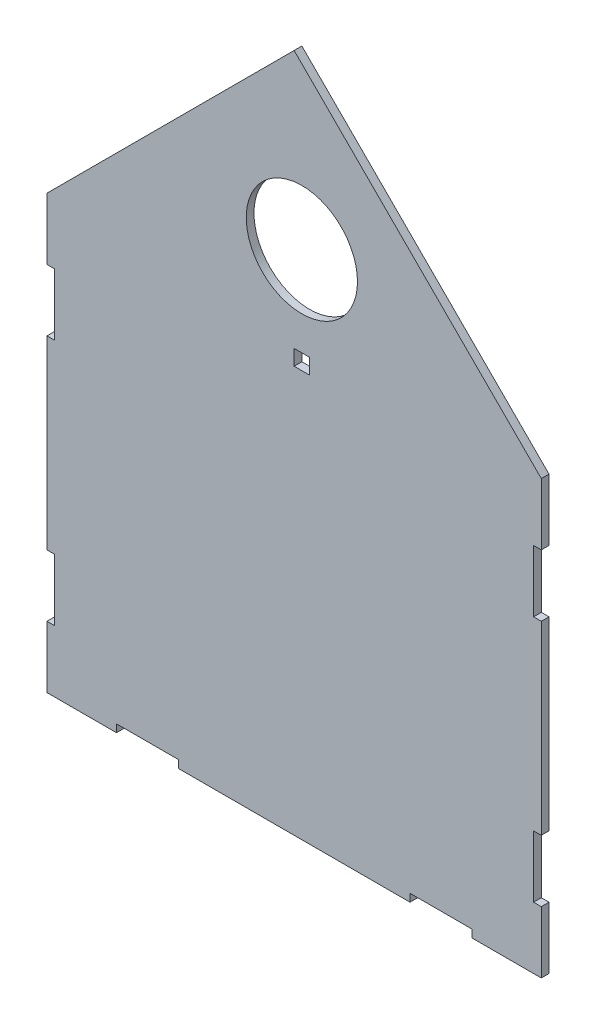
ISO-10303-21;
HEADER;
FILE_DESCRIPTION(('STEP AP214'),'2;1');
FILE_NAME('part.step','',(''),(''),'','','');
FILE_SCHEMA(('AUTOMOTIVE_DESIGN { 1 0 10303 214 1 1 1 1 }'));
ENDSEC;
DATA;
#1=APPLICATION_CONTEXT('core data for automotive mechanical design processes');
#2=APPLICATION_PROTOCOL_DEFINITION('international standard','automotive_design',2000,#1);
#3=PRODUCT_CONTEXT('',#1,'mechanical');
#4=PRODUCT('Part','Part','',(#3));
#5=PRODUCT_RELATED_PRODUCT_CATEGORY('part','',(#4));
#6=PRODUCT_DEFINITION_FORMATION('','',#4);
#7=PRODUCT_DEFINITION_CONTEXT('part definition',#1,'design');
#8=PRODUCT_DEFINITION('design','',#6,#7);
#9=PRODUCT_DEFINITION_SHAPE('','',#8);
#10=(LENGTH_UNIT() NAMED_UNIT(*) SI_UNIT(.MILLI.,.METRE.));
#11=(NAMED_UNIT(*) PLANE_ANGLE_UNIT() SI_UNIT($,.RADIAN.));
#12=(NAMED_UNIT(*) SI_UNIT($,.STERADIAN.) SOLID_ANGLE_UNIT());
#13=UNCERTAINTY_MEASURE_WITH_UNIT(LENGTH_MEASURE(1.E-05),#10,'distance_accuracy_value','');
#14=(GEOMETRIC_REPRESENTATION_CONTEXT(3) GLOBAL_UNCERTAINTY_ASSIGNED_CONTEXT((#13)) GLOBAL_UNIT_ASSIGNED_CONTEXT((#10,
#11,#12)) REPRESENTATION_CONTEXT('',''));
#15=CARTESIAN_POINT('',(0.,0.,0.));
#16=DIRECTION('',(0.,0.,1.));
#17=DIRECTION('',(1.,0.,0.));
#18=AXIS2_PLACEMENT_3D('',#15,#16,#17);
#19=CARTESIAN_POINT('',(102.164315933227,177.8,3.175));
#20=DIRECTION('',(-0.707106781186547,-0.707106781186548,0.));
#21=DIRECTION('',(0.707106781186548,-0.707106781186547,0.));
#22=AXIS2_PLACEMENT_3D('',#19,#20,#21);
#23=PLANE('',#22);
#24=DIRECTION('',(-0.707106781186548,0.707106781186547,0.));
#25=VECTOR('',#24,1.);
#26=CARTESIAN_POINT('',(102.164315933227,177.8,0.));
#27=LINE('',#26,#25);
#28=CARTESIAN_POINT('',(102.164315933227,177.8,0.));
#29=VERTEX_POINT('',#28);
#30=CARTESIAN_POINT('',(0.564315933226589,279.4,0.));
#31=VERTEX_POINT('',#30);
#32=EDGE_CURVE('E289',#29,#31,#27,.T.);
#33=ORIENTED_EDGE('',*,*,#32,.T.);
#34=DIRECTION('',(0.,0.,-1.));
#35=VECTOR('',#34,1.);
#36=CARTESIAN_POINT('',(0.564315933226589,279.4,3.175));
#37=LINE('',#36,#35);
#38=CARTESIAN_POINT('',(0.564315933226589,279.4,3.175));
#39=VERTEX_POINT('',#38);
#40=EDGE_CURVE('E11',#39,#31,#37,.T.);
#41=ORIENTED_EDGE('',*,*,#40,.F.);
#42=DIRECTION('',(-0.707106781186548,0.707106781186547,0.));
#43=VECTOR('',#42,1.);
#44=CARTESIAN_POINT('',(102.164315933227,177.8,3.175));
#45=LINE('',#44,#43);
#46=CARTESIAN_POINT('',(102.164315933227,177.8,3.175));
#47=VERTEX_POINT('',#46);
#48=EDGE_CURVE('E292',#47,#39,#45,.T.);
#49=ORIENTED_EDGE('',*,*,#48,.F.);
#50=DIRECTION('',(0.,0.,-1.));
#51=VECTOR('',#50,1.);
#52=CARTESIAN_POINT('',(102.164315933227,177.8,3.175));
#53=LINE('',#52,#51);
#54=EDGE_CURVE('E352',#47,#29,#53,.T.);
#55=ORIENTED_EDGE('',*,*,#54,.T.);
#56=EDGE_LOOP('',(#33,#41,#49,#55));
#57=FACE_BOUND('',#56,.T.);
#58=ADVANCED_FACE('F35',(#57),#23,.F.);
#59=CARTESIAN_POINT('',(0.564315933226589,279.4,3.175));
#60=DIRECTION('',(0.707106781186547,-0.707106781186548,0.));
#61=DIRECTION('',(0.707106781186548,0.707106781186547,0.));
#62=AXIS2_PLACEMENT_3D('',#59,#60,#61);
#63=PLANE('',#62);
#64=DIRECTION('',(-0.707106781186548,-0.707106781186547,0.));
#65=VECTOR('',#64,1.);
#66=CARTESIAN_POINT('',(0.564315933226589,279.4,0.));
#67=LINE('',#66,#65);
#68=CARTESIAN_POINT('',(-101.035684066773,177.8,0.));
#69=VERTEX_POINT('',#68);
#70=EDGE_CURVE('E355',#31,#69,#67,.T.);
#71=ORIENTED_EDGE('',*,*,#70,.T.);
#72=DIRECTION('',(0.,0.,-1.));
#73=VECTOR('',#72,1.);
#74=CARTESIAN_POINT('',(-101.035684066773,177.8,3.175));
#75=LINE('',#74,#73);
#76=CARTESIAN_POINT('',(-101.035684066773,177.8,3.175));
#77=VERTEX_POINT('',#76);
#78=EDGE_CURVE('E42',#77,#69,#75,.T.);
#79=ORIENTED_EDGE('',*,*,#78,.F.);
#80=DIRECTION('',(-0.707106781186548,-0.707106781186547,0.));
#81=VECTOR('',#80,1.);
#82=CARTESIAN_POINT('',(0.564315933226589,279.4,3.175));
#83=LINE('',#82,#81);
#84=EDGE_CURVE('E295',#39,#77,#83,.T.);
#85=ORIENTED_EDGE('',*,*,#84,.F.);
#86=ORIENTED_EDGE('',*,*,#40,.T.);
#87=EDGE_LOOP('',(#71,#79,#85,#86));
#88=FACE_BOUND('',#87,.T.);
#89=ADVANCED_FACE('F516',(#88),#63,.F.);
#90=CARTESIAN_POINT('',(-101.035684066773,177.8,3.175));
#91=DIRECTION('',(1.,0.,0.));
#92=DIRECTION('',(0.,0.,-1.));
#93=AXIS2_PLACEMENT_3D('',#90,#91,#92);
#94=PLANE('',#93);
#95=DIRECTION('',(0.,-1.,0.));
#96=VECTOR('',#95,1.);
#97=CARTESIAN_POINT('',(-101.035684066773,177.8,0.));
#98=LINE('',#97,#96);
#99=CARTESIAN_POINT('',(-101.035684066773,152.4,0.));
#100=VERTEX_POINT('',#99);
#101=EDGE_CURVE('E357',#69,#100,#98,.T.);
#102=ORIENTED_EDGE('',*,*,#101,.T.);
#103=DIRECTION('',(0.,0.,-1.));
#104=VECTOR('',#103,1.);
#105=CARTESIAN_POINT('',(-101.035684066773,152.4,3.175));
#106=LINE('',#105,#104);
#107=CARTESIAN_POINT('',(-101.035684066773,152.4,3.175));
#108=VERTEX_POINT('',#107);
#109=EDGE_CURVE('E487',#108,#100,#106,.T.);
#110=ORIENTED_EDGE('',*,*,#109,.F.);
#111=DIRECTION('',(0.,-1.,0.));
#112=VECTOR('',#111,1.);
#113=CARTESIAN_POINT('',(-101.035684066773,177.8,3.175));
#114=LINE('',#113,#112);
#115=EDGE_CURVE('E298',#77,#108,#114,.T.);
#116=ORIENTED_EDGE('',*,*,#115,.F.);
#117=ORIENTED_EDGE('',*,*,#78,.T.);
#118=EDGE_LOOP('',(#102,#110,#116,#117));
#119=FACE_BOUND('',#118,.T.);
#120=ADVANCED_FACE('F494',(#119),#94,.F.);
#121=CARTESIAN_POINT('',(-101.035684066773,152.4,3.175));
#122=DIRECTION('',(0.,1.,0.));
#123=DIRECTION('',(0.,0.,1.));
#124=AXIS2_PLACEMENT_3D('',#121,#122,#123);
#125=PLANE('',#124);
#126=DIRECTION('',(1.,0.,0.));
#127=VECTOR('',#126,1.);
#128=CARTESIAN_POINT('',(-101.035684066773,152.4,0.));
#129=LINE('',#128,#127);
#130=CARTESIAN_POINT('',(-97.8606840667734,152.4,0.));
#131=VERTEX_POINT('',#130);
#132=EDGE_CURVE('E359',#100,#131,#129,.T.);
#133=ORIENTED_EDGE('',*,*,#132,.T.);
#134=DIRECTION('',(0.,0.,-1.));
#135=VECTOR('',#134,1.);
#136=CARTESIAN_POINT('',(-97.8606840667734,152.4,3.175));
#137=LINE('',#136,#135);
#138=CARTESIAN_POINT('',(-97.8606840667734,152.4,3.175));
#139=VERTEX_POINT('',#138);
#140=EDGE_CURVE('E484',#139,#131,#137,.T.);
#141=ORIENTED_EDGE('',*,*,#140,.F.);
#142=DIRECTION('',(1.,0.,0.));
#143=VECTOR('',#142,1.);
#144=CARTESIAN_POINT('',(-101.035684066773,152.4,3.175));
#145=LINE('',#144,#143);
#146=EDGE_CURVE('E300',#108,#139,#145,.T.);
#147=ORIENTED_EDGE('',*,*,#146,.F.);
#148=ORIENTED_EDGE('',*,*,#109,.T.);
#149=EDGE_LOOP('',(#133,#141,#147,#148));
#150=FACE_BOUND('',#149,.T.);
#151=ADVANCED_FACE('F504',(#150),#125,.F.);
#152=CARTESIAN_POINT('',(-97.8606840667734,152.4,3.175));
#153=DIRECTION('',(1.,0.,0.));
#154=DIRECTION('',(0.,0.,-1.));
#155=AXIS2_PLACEMENT_3D('',#152,#153,#154);
#156=PLANE('',#155);
#157=DIRECTION('',(0.,-1.,0.));
#158=VECTOR('',#157,1.);
#159=CARTESIAN_POINT('',(-97.8606840667734,152.4,0.));
#160=LINE('',#159,#158);
#161=CARTESIAN_POINT('',(-97.8606840667734,127.,0.));
#162=VERTEX_POINT('',#161);
#163=EDGE_CURVE('E361',#131,#162,#160,.T.);
#164=ORIENTED_EDGE('',*,*,#163,.T.);
#165=DIRECTION('',(0.,0.,-1.));
#166=VECTOR('',#165,1.);
#167=CARTESIAN_POINT('',(-97.8606840667734,127.,3.175));
#168=LINE('',#167,#166);
#169=CARTESIAN_POINT('',(-97.8606840667734,127.,3.175));
#170=VERTEX_POINT('',#169);
#171=EDGE_CURVE('E481',#170,#162,#168,.T.);
#172=ORIENTED_EDGE('',*,*,#171,.F.);
#173=DIRECTION('',(0.,-1.,0.));
#174=VECTOR('',#173,1.);
#175=CARTESIAN_POINT('',(-97.8606840667734,152.4,3.175));
#176=LINE('',#175,#174);
#177=EDGE_CURVE('E302',#139,#170,#176,.T.);
#178=ORIENTED_EDGE('',*,*,#177,.F.);
#179=ORIENTED_EDGE('',*,*,#140,.T.);
#180=EDGE_LOOP('',(#164,#172,#178,#179));
#181=FACE_BOUND('',#180,.T.);
#182=ADVANCED_FACE('F508',(#181),#156,.F.);
#183=CARTESIAN_POINT('',(-97.8606840667734,127.,3.175));
#184=DIRECTION('',(0.,-1.,0.));
#185=DIRECTION('',(0.,0.,-1.));
#186=AXIS2_PLACEMENT_3D('',#183,#184,#185);
#187=PLANE('',#186);
#188=DIRECTION('',(-1.,0.,0.));
#189=VECTOR('',#188,1.);
#190=CARTESIAN_POINT('',(-97.8606840667734,127.,0.));
#191=LINE('',#190,#189);
#192=CARTESIAN_POINT('',(-101.035684066773,127.,0.));
#193=VERTEX_POINT('',#192);
#194=EDGE_CURVE('E363',#162,#193,#191,.T.);
#195=ORIENTED_EDGE('',*,*,#194,.T.);
#196=DIRECTION('',(0.,0.,-1.));
#197=VECTOR('',#196,1.);
#198=CARTESIAN_POINT('',(-101.035684066773,127.,3.175));
#199=LINE('',#198,#197);
#200=CARTESIAN_POINT('',(-101.035684066773,127.,3.175));
#201=VERTEX_POINT('',#200);
#202=EDGE_CURVE('E478',#201,#193,#199,.T.);
#203=ORIENTED_EDGE('',*,*,#202,.F.);
#204=DIRECTION('',(-1.,0.,0.));
#205=VECTOR('',#204,1.);
#206=CARTESIAN_POINT('',(-97.8606840667734,127.,3.175));
#207=LINE('',#206,#205);
#208=EDGE_CURVE('E304',#170,#201,#207,.T.);
#209=ORIENTED_EDGE('',*,*,#208,.F.);
#210=ORIENTED_EDGE('',*,*,#171,.T.);
#211=EDGE_LOOP('',(#195,#203,#209,#210));
#212=FACE_BOUND('',#211,.T.);
#213=ADVANCED_FACE('F634',(#212),#187,.F.);
#214=CARTESIAN_POINT('',(-101.035684066773,127.,3.175));
#215=DIRECTION('',(1.,0.,0.));
#216=DIRECTION('',(0.,1.,0.));
#217=AXIS2_PLACEMENT_3D('',#214,#215,#216);
#218=PLANE('',#217);
#219=DIRECTION('',(0.,-1.,0.));
#220=VECTOR('',#219,1.);
#221=CARTESIAN_POINT('',(-101.035684066773,127.,0.));
#222=LINE('',#221,#220);
#223=CARTESIAN_POINT('',(-101.035684066773,50.8,0.));
#224=VERTEX_POINT('',#223);
#225=EDGE_CURVE('E365',#193,#224,#222,.T.);
#226=ORIENTED_EDGE('',*,*,#225,.T.);
#227=DIRECTION('',(0.,0.,-1.));
#228=VECTOR('',#227,1.);
#229=CARTESIAN_POINT('',(-101.035684066773,50.8,3.175));
#230=LINE('',#229,#228);
#231=CARTESIAN_POINT('',(-101.035684066773,50.8,3.175));
#232=VERTEX_POINT('',#231);
#233=EDGE_CURVE('E475',#232,#224,#230,.T.);
#234=ORIENTED_EDGE('',*,*,#233,.F.);
#235=DIRECTION('',(0.,-1.,0.));
#236=VECTOR('',#235,1.);
#237=CARTESIAN_POINT('',(-101.035684066773,127.,3.175));
#238=LINE('',#237,#236);
#239=EDGE_CURVE('E306',#201,#232,#238,.T.);
#240=ORIENTED_EDGE('',*,*,#239,.F.);
#241=ORIENTED_EDGE('',*,*,#202,.T.);
#242=EDGE_LOOP('',(#226,#234,#240,#241));
#243=FACE_BOUND('',#242,.T.);
#244=ADVANCED_FACE('F632',(#243),#218,.F.);
#245=CARTESIAN_POINT('',(-101.035684066773,50.8,3.175));
#246=DIRECTION('',(0.,1.,0.));
#247=DIRECTION('',(0.,0.,1.));
#248=AXIS2_PLACEMENT_3D('',#245,#246,#247);
#249=PLANE('',#248);
#250=DIRECTION('',(1.,0.,0.));
#251=VECTOR('',#250,1.);
#252=CARTESIAN_POINT('',(-101.035684066773,50.8,0.));
#253=LINE('',#252,#251);
#254=CARTESIAN_POINT('',(-97.8606840667734,50.8,0.));
#255=VERTEX_POINT('',#254);
#256=EDGE_CURVE('E367',#224,#255,#253,.T.);
#257=ORIENTED_EDGE('',*,*,#256,.T.);
#258=DIRECTION('',(0.,0.,-1.));
#259=VECTOR('',#258,1.);
#260=CARTESIAN_POINT('',(-97.8606840667734,50.8,3.175));
#261=LINE('',#260,#259);
#262=CARTESIAN_POINT('',(-97.8606840667734,50.8,3.175));
#263=VERTEX_POINT('',#262);
#264=EDGE_CURVE('E472',#263,#255,#261,.T.);
#265=ORIENTED_EDGE('',*,*,#264,.F.);
#266=DIRECTION('',(1.,0.,0.));
#267=VECTOR('',#266,1.);
#268=CARTESIAN_POINT('',(-101.035684066773,50.8,3.175));
#269=LINE('',#268,#267);
#270=EDGE_CURVE('E308',#232,#263,#269,.T.);
#271=ORIENTED_EDGE('',*,*,#270,.F.);
#272=ORIENTED_EDGE('',*,*,#233,.T.);
#273=EDGE_LOOP('',(#257,#265,#271,#272));
#274=FACE_BOUND('',#273,.T.);
#275=ADVANCED_FACE('F627',(#274),#249,.F.);
#276=CARTESIAN_POINT('',(-97.8606840667734,50.8,3.175));
#277=DIRECTION('',(1.,0.,0.));
#278=DIRECTION('',(0.,0.,-1.));
#279=AXIS2_PLACEMENT_3D('',#276,#277,#278);
#280=PLANE('',#279);
#281=DIRECTION('',(0.,-1.,0.));
#282=VECTOR('',#281,1.);
#283=CARTESIAN_POINT('',(-97.8606840667734,50.8,0.));
#284=LINE('',#283,#282);
#285=CARTESIAN_POINT('',(-97.8606840667734,25.4,0.));
#286=VERTEX_POINT('',#285);
#287=EDGE_CURVE('E369',#255,#286,#284,.T.);
#288=ORIENTED_EDGE('',*,*,#287,.T.);
#289=DIRECTION('',(0.,0.,-1.));
#290=VECTOR('',#289,1.);
#291=CARTESIAN_POINT('',(-97.8606840667734,25.4,3.175));
#292=LINE('',#291,#290);
#293=CARTESIAN_POINT('',(-97.8606840667734,25.4,3.175));
#294=VERTEX_POINT('',#293);
#295=EDGE_CURVE('E469',#294,#286,#292,.T.);
#296=ORIENTED_EDGE('',*,*,#295,.F.);
#297=DIRECTION('',(0.,-1.,0.));
#298=VECTOR('',#297,1.);
#299=CARTESIAN_POINT('',(-97.8606840667734,50.8,3.175));
#300=LINE('',#299,#298);
#301=EDGE_CURVE('E310',#263,#294,#300,.T.);
#302=ORIENTED_EDGE('',*,*,#301,.F.);
#303=ORIENTED_EDGE('',*,*,#264,.T.);
#304=EDGE_LOOP('',(#288,#296,#302,#303));
#305=FACE_BOUND('',#304,.T.);
#306=ADVANCED_FACE('F622',(#305),#280,.F.);
#307=CARTESIAN_POINT('',(-97.8606840667734,25.4,3.175));
#308=DIRECTION('',(0.,-1.,0.));
#309=DIRECTION('',(0.,0.,-1.));
#310=AXIS2_PLACEMENT_3D('',#307,#308,#309);
#311=PLANE('',#310);
#312=DIRECTION('',(-1.,0.,0.));
#313=VECTOR('',#312,1.);
#314=CARTESIAN_POINT('',(-97.8606840667734,25.4,0.));
#315=LINE('',#314,#313);
#316=CARTESIAN_POINT('',(-101.035684066773,25.4,0.));
#317=VERTEX_POINT('',#316);
#318=EDGE_CURVE('E371',#286,#317,#315,.T.);
#319=ORIENTED_EDGE('',*,*,#318,.T.);
#320=DIRECTION('',(0.,0.,-1.));
#321=VECTOR('',#320,1.);
#322=CARTESIAN_POINT('',(-101.035684066773,25.4,3.175));
#323=LINE('',#322,#321);
#324=CARTESIAN_POINT('',(-101.035684066773,25.4,3.175));
#325=VERTEX_POINT('',#324);
#326=EDGE_CURVE('E466',#325,#317,#323,.T.);
#327=ORIENTED_EDGE('',*,*,#326,.F.);
#328=DIRECTION('',(-1.,0.,0.));
#329=VECTOR('',#328,1.);
#330=CARTESIAN_POINT('',(-97.8606840667734,25.4,3.175));
#331=LINE('',#330,#329);
#332=EDGE_CURVE('E312',#294,#325,#331,.T.);
#333=ORIENTED_EDGE('',*,*,#332,.F.);
#334=ORIENTED_EDGE('',*,*,#295,.T.);
#335=EDGE_LOOP('',(#319,#327,#333,#334));
#336=FACE_BOUND('',#335,.T.);
#337=ADVANCED_FACE('F618',(#336),#311,.F.);
#338=CARTESIAN_POINT('',(-101.035684066773,25.4,3.175));
#339=DIRECTION('',(1.,0.,0.));
#340=DIRECTION('',(0.,0.,-1.));
#341=AXIS2_PLACEMENT_3D('',#338,#339,#340);
#342=PLANE('',#341);
#343=DIRECTION('',(0.,-1.,0.));
#344=VECTOR('',#343,1.);
#345=CARTESIAN_POINT('',(-101.035684066773,25.4,0.));
#346=LINE('',#345,#344);
#347=CARTESIAN_POINT('',(-101.035684066773,0.,0.));
#348=VERTEX_POINT('',#347);
#349=EDGE_CURVE('E373',#317,#348,#346,.T.);
#350=ORIENTED_EDGE('',*,*,#349,.T.);
#351=DIRECTION('',(0.,0.,-1.));
#352=VECTOR('',#351,1.);
#353=CARTESIAN_POINT('',(-101.035684066773,0.,3.175));
#354=LINE('',#353,#352);
#355=CARTESIAN_POINT('',(-101.035684066773,0.,3.175));
#356=VERTEX_POINT('',#355);
#357=EDGE_CURVE('E463',#356,#348,#354,.T.);
#358=ORIENTED_EDGE('',*,*,#357,.F.);
#359=DIRECTION('',(0.,-1.,0.));
#360=VECTOR('',#359,1.);
#361=CARTESIAN_POINT('',(-101.035684066773,25.4,3.175));
#362=LINE('',#361,#360);
#363=EDGE_CURVE('E314',#325,#356,#362,.T.);
#364=ORIENTED_EDGE('',*,*,#363,.F.);
#365=ORIENTED_EDGE('',*,*,#326,.T.);
#366=EDGE_LOOP('',(#350,#358,#364,#365));
#367=FACE_BOUND('',#366,.T.);
#368=ADVANCED_FACE('F613',(#367),#342,.F.);
#369=CARTESIAN_POINT('',(-101.035684066773,0.,3.175));
#370=DIRECTION('',(0.,1.,0.));
#371=DIRECTION('',(0.,0.,1.));
#372=AXIS2_PLACEMENT_3D('',#369,#370,#371);
#373=PLANE('',#372);
#374=DIRECTION('',(1.,0.,0.));
#375=VECTOR('',#374,1.);
#376=CARTESIAN_POINT('',(-101.035684066773,0.,0.));
#377=LINE('',#376,#375);
#378=CARTESIAN_POINT('',(-72.4606840667734,0.,0.));
#379=VERTEX_POINT('',#378);
#380=EDGE_CURVE('E375',#348,#379,#377,.T.);
#381=ORIENTED_EDGE('',*,*,#380,.T.);
#382=DIRECTION('',(0.,0.,-1.));
#383=VECTOR('',#382,1.);
#384=CARTESIAN_POINT('',(-72.4606840667734,0.,3.175));
#385=LINE('',#384,#383);
#386=CARTESIAN_POINT('',(-72.4606840667734,0.,3.175));
#387=VERTEX_POINT('',#386);
#388=EDGE_CURVE('E460',#387,#379,#385,.T.);
#389=ORIENTED_EDGE('',*,*,#388,.F.);
#390=DIRECTION('',(1.,0.,0.));
#391=VECTOR('',#390,1.);
#392=CARTESIAN_POINT('',(-101.035684066773,0.,3.175));
#393=LINE('',#392,#391);
#394=EDGE_CURVE('E316',#356,#387,#393,.T.);
#395=ORIENTED_EDGE('',*,*,#394,.F.);
#396=ORIENTED_EDGE('',*,*,#357,.T.);
#397=EDGE_LOOP('',(#381,#389,#395,#396));
#398=FACE_BOUND('',#397,.T.);
#399=ADVANCED_FACE('F607',(#398),#373,.F.);
#400=CARTESIAN_POINT('',(-72.4606840667734,0.,3.175));
#401=DIRECTION('',(-1.,0.,0.));
#402=DIRECTION('',(0.,0.,1.));
#403=AXIS2_PLACEMENT_3D('',#400,#401,#402);
#404=PLANE('',#403);
#405=DIRECTION('',(0.,1.,0.));
#406=VECTOR('',#405,1.);
#407=CARTESIAN_POINT('',(-72.4606840667734,0.,0.));
#408=LINE('',#407,#406);
#409=CARTESIAN_POINT('',(-72.4606840667734,3.175,0.));
#410=VERTEX_POINT('',#409);
#411=EDGE_CURVE('E377',#379,#410,#408,.T.);
#412=ORIENTED_EDGE('',*,*,#411,.T.);
#413=DIRECTION('',(0.,0.,-1.));
#414=VECTOR('',#413,1.);
#415=CARTESIAN_POINT('',(-72.4606840667734,3.175,3.175));
#416=LINE('',#415,#414);
#417=CARTESIAN_POINT('',(-72.4606840667734,3.175,3.175));
#418=VERTEX_POINT('',#417);
#419=EDGE_CURVE('E457',#418,#410,#416,.T.);
#420=ORIENTED_EDGE('',*,*,#419,.F.);
#421=DIRECTION('',(0.,1.,0.));
#422=VECTOR('',#421,1.);
#423=CARTESIAN_POINT('',(-72.4606840667734,0.,3.175));
#424=LINE('',#423,#422);
#425=EDGE_CURVE('E318',#387,#418,#424,.T.);
#426=ORIENTED_EDGE('',*,*,#425,.F.);
#427=ORIENTED_EDGE('',*,*,#388,.T.);
#428=EDGE_LOOP('',(#412,#420,#426,#427));
#429=FACE_BOUND('',#428,.T.);
#430=ADVANCED_FACE('F603',(#429),#404,.F.);
#431=CARTESIAN_POINT('',(-72.4606840667734,3.175,3.175));
#432=DIRECTION('',(0.,1.,0.));
#433=DIRECTION('',(-1.,0.,0.));
#434=AXIS2_PLACEMENT_3D('',#431,#432,#433);
#435=PLANE('',#434);
#436=DIRECTION('',(1.,0.,0.));
#437=VECTOR('',#436,1.);
#438=CARTESIAN_POINT('',(-72.4606840667734,3.175,0.));
#439=LINE('',#438,#437);
#440=CARTESIAN_POINT('',(-47.0606840667734,3.175,0.));
#441=VERTEX_POINT('',#440);
#442=EDGE_CURVE('E379',#410,#441,#439,.T.);
#443=ORIENTED_EDGE('',*,*,#442,.T.);
#444=DIRECTION('',(0.,0.,-1.));
#445=VECTOR('',#444,1.);
#446=CARTESIAN_POINT('',(-47.0606840667734,3.175,3.175));
#447=LINE('',#446,#445);
#448=CARTESIAN_POINT('',(-47.0606840667734,3.175,3.175));
#449=VERTEX_POINT('',#448);
#450=EDGE_CURVE('E454',#449,#441,#447,.T.);
#451=ORIENTED_EDGE('',*,*,#450,.F.);
#452=DIRECTION('',(1.,0.,0.));
#453=VECTOR('',#452,1.);
#454=CARTESIAN_POINT('',(-72.4606840667734,3.175,3.175));
#455=LINE('',#454,#453);
#456=EDGE_CURVE('E320',#418,#449,#455,.T.);
#457=ORIENTED_EDGE('',*,*,#456,.F.);
#458=ORIENTED_EDGE('',*,*,#419,.T.);
#459=EDGE_LOOP('',(#443,#451,#457,#458));
#460=FACE_BOUND('',#459,.T.);
#461=ADVANCED_FACE('F598',(#460),#435,.F.);
#462=CARTESIAN_POINT('',(-47.0606840667734,3.175,3.175));
#463=DIRECTION('',(1.,0.,0.));
#464=DIRECTION('',(0.,0.,-1.));
#465=AXIS2_PLACEMENT_3D('',#462,#463,#464);
#466=PLANE('',#465);
#467=DIRECTION('',(0.,-1.,0.));
#468=VECTOR('',#467,1.);
#469=CARTESIAN_POINT('',(-47.0606840667734,3.175,0.));
#470=LINE('',#469,#468);
#471=CARTESIAN_POINT('',(-47.0606840667734,0.,0.));
#472=VERTEX_POINT('',#471);
#473=EDGE_CURVE('E381',#441,#472,#470,.T.);
#474=ORIENTED_EDGE('',*,*,#473,.T.);
#475=DIRECTION('',(0.,0.,-1.));
#476=VECTOR('',#475,1.);
#477=CARTESIAN_POINT('',(-47.0606840667734,0.,3.175));
#478=LINE('',#477,#476);
#479=CARTESIAN_POINT('',(-47.0606840667734,0.,3.175));
#480=VERTEX_POINT('',#479);
#481=EDGE_CURVE('E451',#480,#472,#478,.T.);
#482=ORIENTED_EDGE('',*,*,#481,.F.);
#483=DIRECTION('',(0.,-1.,0.));
#484=VECTOR('',#483,1.);
#485=CARTESIAN_POINT('',(-47.0606840667734,3.175,3.175));
#486=LINE('',#485,#484);
#487=EDGE_CURVE('E322',#449,#480,#486,.T.);
#488=ORIENTED_EDGE('',*,*,#487,.F.);
#489=ORIENTED_EDGE('',*,*,#450,.T.);
#490=EDGE_LOOP('',(#474,#482,#488,#489));
#491=FACE_BOUND('',#490,.T.);
#492=ADVANCED_FACE('F592',(#491),#466,.F.);
#493=CARTESIAN_POINT('',(-47.0606840667734,0.,3.175));
#494=DIRECTION('',(0.,1.,0.));
#495=DIRECTION('',(-1.,0.,0.));
#496=AXIS2_PLACEMENT_3D('',#493,#494,#495);
#497=PLANE('',#496);
#498=DIRECTION('',(1.,0.,0.));
#499=VECTOR('',#498,1.);
#500=CARTESIAN_POINT('',(-47.0606840667734,0.,0.));
#501=LINE('',#500,#499);
#502=CARTESIAN_POINT('',(48.1893159332266,0.,0.));
#503=VERTEX_POINT('',#502);
#504=EDGE_CURVE('E383',#472,#503,#501,.T.);
#505=ORIENTED_EDGE('',*,*,#504,.T.);
#506=DIRECTION('',(0.,0.,-1.));
#507=VECTOR('',#506,1.);
#508=CARTESIAN_POINT('',(48.1893159332266,0.,3.175));
#509=LINE('',#508,#507);
#510=CARTESIAN_POINT('',(48.1893159332266,0.,3.175));
#511=VERTEX_POINT('',#510);
#512=EDGE_CURVE('E448',#511,#503,#509,.T.);
#513=ORIENTED_EDGE('',*,*,#512,.F.);
#514=DIRECTION('',(1.,0.,0.));
#515=VECTOR('',#514,1.);
#516=CARTESIAN_POINT('',(-47.0606840667734,0.,3.175));
#517=LINE('',#516,#515);
#518=EDGE_CURVE('E324',#480,#511,#517,.T.);
#519=ORIENTED_EDGE('',*,*,#518,.F.);
#520=ORIENTED_EDGE('',*,*,#481,.T.);
#521=EDGE_LOOP('',(#505,#513,#519,#520));
#522=FACE_BOUND('',#521,.T.);
#523=ADVANCED_FACE('F588',(#522),#497,.F.);
#524=CARTESIAN_POINT('',(48.1893159332266,0.,3.175));
#525=DIRECTION('',(-1.,0.,0.));
#526=DIRECTION('',(0.,0.,1.));
#527=AXIS2_PLACEMENT_3D('',#524,#525,#526);
#528=PLANE('',#527);
#529=DIRECTION('',(0.,1.,0.));
#530=VECTOR('',#529,1.);
#531=CARTESIAN_POINT('',(48.1893159332266,0.,0.));
#532=LINE('',#531,#530);
#533=CARTESIAN_POINT('',(48.1893159332266,3.175,0.));
#534=VERTEX_POINT('',#533);
#535=EDGE_CURVE('E385',#503,#534,#532,.T.);
#536=ORIENTED_EDGE('',*,*,#535,.T.);
#537=DIRECTION('',(0.,0.,-1.));
#538=VECTOR('',#537,1.);
#539=CARTESIAN_POINT('',(48.1893159332266,3.175,3.175));
#540=LINE('',#539,#538);
#541=CARTESIAN_POINT('',(48.1893159332266,3.175,3.175));
#542=VERTEX_POINT('',#541);
#543=EDGE_CURVE('E445',#542,#534,#540,.T.);
#544=ORIENTED_EDGE('',*,*,#543,.F.);
#545=DIRECTION('',(0.,1.,0.));
#546=VECTOR('',#545,1.);
#547=CARTESIAN_POINT('',(48.1893159332266,0.,3.175));
#548=LINE('',#547,#546);
#549=EDGE_CURVE('E326',#511,#542,#548,.T.);
#550=ORIENTED_EDGE('',*,*,#549,.F.);
#551=ORIENTED_EDGE('',*,*,#512,.T.);
#552=EDGE_LOOP('',(#536,#544,#550,#551));
#553=FACE_BOUND('',#552,.T.);
#554=ADVANCED_FACE('F583',(#553),#528,.F.);
#555=CARTESIAN_POINT('',(48.1893159332266,3.175,3.175));
#556=DIRECTION('',(0.,1.,0.));
#557=DIRECTION('',(-1.,0.,0.));
#558=AXIS2_PLACEMENT_3D('',#555,#556,#557);
#559=PLANE('',#558);
#560=DIRECTION('',(1.,0.,0.));
#561=VECTOR('',#560,1.);
#562=CARTESIAN_POINT('',(48.1893159332266,3.175,0.));
#563=LINE('',#562,#561);
#564=CARTESIAN_POINT('',(73.5893159332266,3.17500000000002,0.));
#565=VERTEX_POINT('',#564);
#566=EDGE_CURVE('E387',#534,#565,#563,.T.);
#567=ORIENTED_EDGE('',*,*,#566,.T.);
#568=DIRECTION('',(0.,0.,-1.));
#569=VECTOR('',#568,1.);
#570=CARTESIAN_POINT('',(73.5893159332266,3.17500000000002,3.175));
#571=LINE('',#570,#569);
#572=CARTESIAN_POINT('',(73.5893159332266,3.17500000000002,3.175));
#573=VERTEX_POINT('',#572);
#574=EDGE_CURVE('E442',#573,#565,#571,.T.);
#575=ORIENTED_EDGE('',*,*,#574,.F.);
#576=DIRECTION('',(1.,0.,0.));
#577=VECTOR('',#576,1.);
#578=CARTESIAN_POINT('',(48.1893159332266,3.175,3.175));
#579=LINE('',#578,#577);
#580=EDGE_CURVE('E328',#542,#573,#579,.T.);
#581=ORIENTED_EDGE('',*,*,#580,.F.);
#582=ORIENTED_EDGE('',*,*,#543,.T.);
#583=EDGE_LOOP('',(#567,#575,#581,#582));
#584=FACE_BOUND('',#583,.T.);
#585=ADVANCED_FACE('F577',(#584),#559,.F.);
#586=CARTESIAN_POINT('',(73.5893159332266,3.17500000000002,3.175));
#587=DIRECTION('',(1.,0.,0.));
#588=DIRECTION('',(0.,0.,-1.));
#589=AXIS2_PLACEMENT_3D('',#586,#587,#588);
#590=PLANE('',#589);
#591=DIRECTION('',(0.,-1.,0.));
#592=VECTOR('',#591,1.);
#593=CARTESIAN_POINT('',(73.5893159332266,3.17500000000002,0.));
#594=LINE('',#593,#592);
#595=CARTESIAN_POINT('',(73.5893159332266,0.,0.));
#596=VERTEX_POINT('',#595);
#597=EDGE_CURVE('E389',#565,#596,#594,.T.);
#598=ORIENTED_EDGE('',*,*,#597,.T.);
#599=DIRECTION('',(0.,0.,-1.));
#600=VECTOR('',#599,1.);
#601=CARTESIAN_POINT('',(73.5893159332266,0.,3.175));
#602=LINE('',#601,#600);
#603=CARTESIAN_POINT('',(73.5893159332266,0.,3.175));
#604=VERTEX_POINT('',#603);
#605=EDGE_CURVE('E439',#604,#596,#602,.T.);
#606=ORIENTED_EDGE('',*,*,#605,.F.);
#607=DIRECTION('',(0.,-1.,0.));
#608=VECTOR('',#607,1.);
#609=CARTESIAN_POINT('',(73.5893159332266,3.17500000000002,3.175));
#610=LINE('',#609,#608);
#611=EDGE_CURVE('E330',#573,#604,#610,.T.);
#612=ORIENTED_EDGE('',*,*,#611,.F.);
#613=ORIENTED_EDGE('',*,*,#574,.T.);
#614=EDGE_LOOP('',(#598,#606,#612,#613));
#615=FACE_BOUND('',#614,.T.);
#616=ADVANCED_FACE('F573',(#615),#590,.F.);
#617=CARTESIAN_POINT('',(73.5893159332266,0.,3.175));
#618=DIRECTION('',(0.,1.,0.));
#619=DIRECTION('',(0.,0.,1.));
#620=AXIS2_PLACEMENT_3D('',#617,#618,#619);
#621=PLANE('',#620);
#622=DIRECTION('',(1.,0.,0.));
#623=VECTOR('',#622,1.);
#624=CARTESIAN_POINT('',(73.5893159332266,0.,0.));
#625=LINE('',#624,#623);
#626=CARTESIAN_POINT('',(102.164315933227,0.,0.));
#627=VERTEX_POINT('',#626);
#628=EDGE_CURVE('E391',#596,#627,#625,.T.);
#629=ORIENTED_EDGE('',*,*,#628,.T.);
#630=DIRECTION('',(0.,0.,-1.));
#631=VECTOR('',#630,1.);
#632=CARTESIAN_POINT('',(102.164315933227,0.,3.175));
#633=LINE('',#632,#631);
#634=CARTESIAN_POINT('',(102.164315933227,0.,3.175));
#635=VERTEX_POINT('',#634);
#636=EDGE_CURVE('E436',#635,#627,#633,.T.);
#637=ORIENTED_EDGE('',*,*,#636,.F.);
#638=DIRECTION('',(1.,0.,0.));
#639=VECTOR('',#638,1.);
#640=CARTESIAN_POINT('',(73.5893159332266,0.,3.175));
#641=LINE('',#640,#639);
#642=EDGE_CURVE('E332',#604,#635,#641,.T.);
#643=ORIENTED_EDGE('',*,*,#642,.F.);
#644=ORIENTED_EDGE('',*,*,#605,.T.);
#645=EDGE_LOOP('',(#629,#637,#643,#644));
#646=FACE_BOUND('',#645,.T.);
#647=ADVANCED_FACE('F568',(#646),#621,.F.);
#648=CARTESIAN_POINT('',(102.164315933227,0.,3.175));
#649=DIRECTION('',(-1.,0.,0.));
#650=DIRECTION('',(0.,0.,1.));
#651=AXIS2_PLACEMENT_3D('',#648,#649,#650);
#652=PLANE('',#651);
#653=DIRECTION('',(0.,1.,0.));
#654=VECTOR('',#653,1.);
#655=CARTESIAN_POINT('',(102.164315933227,0.,0.));
#656=LINE('',#655,#654);
#657=CARTESIAN_POINT('',(102.164315933227,25.4,0.));
#658=VERTEX_POINT('',#657);
#659=EDGE_CURVE('E393',#627,#658,#656,.T.);
#660=ORIENTED_EDGE('',*,*,#659,.T.);
#661=DIRECTION('',(0.,0.,-1.));
#662=VECTOR('',#661,1.);
#663=CARTESIAN_POINT('',(102.164315933227,25.4,3.175));
#664=LINE('',#663,#662);
#665=CARTESIAN_POINT('',(102.164315933227,25.4,3.175));
#666=VERTEX_POINT('',#665);
#667=EDGE_CURVE('E433',#666,#658,#664,.T.);
#668=ORIENTED_EDGE('',*,*,#667,.F.);
#669=DIRECTION('',(0.,1.,0.));
#670=VECTOR('',#669,1.);
#671=CARTESIAN_POINT('',(102.164315933227,0.,3.175));
#672=LINE('',#671,#670);
#673=EDGE_CURVE('E334',#635,#666,#672,.T.);
#674=ORIENTED_EDGE('',*,*,#673,.F.);
#675=ORIENTED_EDGE('',*,*,#636,.T.);
#676=EDGE_LOOP('',(#660,#668,#674,#675));
#677=FACE_BOUND('',#676,.T.);
#678=ADVANCED_FACE('F562',(#677),#652,.F.);
#679=CARTESIAN_POINT('',(102.164315933227,25.4,3.175));
#680=DIRECTION('',(0.,-1.,0.));
#681=DIRECTION('',(0.,0.,-1.));
#682=AXIS2_PLACEMENT_3D('',#679,#680,#681);
#683=PLANE('',#682);
#684=DIRECTION('',(-1.,0.,0.));
#685=VECTOR('',#684,1.);
#686=CARTESIAN_POINT('',(102.164315933227,25.4,0.));
#687=LINE('',#686,#685);
#688=CARTESIAN_POINT('',(98.9893159332266,25.4,0.));
#689=VERTEX_POINT('',#688);
#690=EDGE_CURVE('E395',#658,#689,#687,.T.);
#691=ORIENTED_EDGE('',*,*,#690,.T.);
#692=DIRECTION('',(0.,0.,-1.));
#693=VECTOR('',#692,1.);
#694=CARTESIAN_POINT('',(98.9893159332266,25.4,3.175));
#695=LINE('',#694,#693);
#696=CARTESIAN_POINT('',(98.9893159332266,25.4,3.175));
#697=VERTEX_POINT('',#696);
#698=EDGE_CURVE('E430',#697,#689,#695,.T.);
#699=ORIENTED_EDGE('',*,*,#698,.F.);
#700=DIRECTION('',(-1.,0.,0.));
#701=VECTOR('',#700,1.);
#702=CARTESIAN_POINT('',(102.164315933227,25.4,3.175));
#703=LINE('',#702,#701);
#704=EDGE_CURVE('E336',#666,#697,#703,.T.);
#705=ORIENTED_EDGE('',*,*,#704,.F.);
#706=ORIENTED_EDGE('',*,*,#667,.T.);
#707=EDGE_LOOP('',(#691,#699,#705,#706));
#708=FACE_BOUND('',#707,.T.);
#709=ADVANCED_FACE('F558',(#708),#683,.F.);
#710=CARTESIAN_POINT('',(98.9893159332266,25.4,3.175));
#711=DIRECTION('',(-1.,0.,0.));
#712=DIRECTION('',(0.,0.,1.));
#713=AXIS2_PLACEMENT_3D('',#710,#711,#712);
#714=PLANE('',#713);
#715=DIRECTION('',(0.,1.,0.));
#716=VECTOR('',#715,1.);
#717=CARTESIAN_POINT('',(98.9893159332266,25.4,0.));
#718=LINE('',#717,#716);
#719=CARTESIAN_POINT('',(98.9893159332266,50.8,0.));
#720=VERTEX_POINT('',#719);
#721=EDGE_CURVE('E397',#689,#720,#718,.T.);
#722=ORIENTED_EDGE('',*,*,#721,.T.);
#723=DIRECTION('',(0.,0.,-1.));
#724=VECTOR('',#723,1.);
#725=CARTESIAN_POINT('',(98.9893159332266,50.8,3.175));
#726=LINE('',#725,#724);
#727=CARTESIAN_POINT('',(98.9893159332266,50.8,3.175));
#728=VERTEX_POINT('',#727);
#729=EDGE_CURVE('E427',#728,#720,#726,.T.);
#730=ORIENTED_EDGE('',*,*,#729,.F.);
#731=DIRECTION('',(0.,1.,0.));
#732=VECTOR('',#731,1.);
#733=CARTESIAN_POINT('',(98.9893159332266,25.4,3.175));
#734=LINE('',#733,#732);
#735=EDGE_CURVE('E338',#697,#728,#734,.T.);
#736=ORIENTED_EDGE('',*,*,#735,.F.);
#737=ORIENTED_EDGE('',*,*,#698,.T.);
#738=EDGE_LOOP('',(#722,#730,#736,#737));
#739=FACE_BOUND('',#738,.T.);
#740=ADVANCED_FACE('F553',(#739),#714,.F.);
#741=CARTESIAN_POINT('',(98.9893159332266,50.8,3.175));
#742=DIRECTION('',(0.,1.,0.));
#743=DIRECTION('',(0.,0.,1.));
#744=AXIS2_PLACEMENT_3D('',#741,#742,#743);
#745=PLANE('',#744);
#746=DIRECTION('',(1.,0.,0.));
#747=VECTOR('',#746,1.);
#748=CARTESIAN_POINT('',(98.9893159332266,50.8,0.));
#749=LINE('',#748,#747);
#750=CARTESIAN_POINT('',(102.164315933227,50.8,0.));
#751=VERTEX_POINT('',#750);
#752=EDGE_CURVE('E399',#720,#751,#749,.T.);
#753=ORIENTED_EDGE('',*,*,#752,.T.);
#754=DIRECTION('',(0.,0.,-1.));
#755=VECTOR('',#754,1.);
#756=CARTESIAN_POINT('',(102.164315933227,50.8,3.175));
#757=LINE('',#756,#755);
#758=CARTESIAN_POINT('',(102.164315933227,50.8,3.175));
#759=VERTEX_POINT('',#758);
#760=EDGE_CURVE('E424',#759,#751,#757,.T.);
#761=ORIENTED_EDGE('',*,*,#760,.F.);
#762=DIRECTION('',(1.,0.,0.));
#763=VECTOR('',#762,1.);
#764=CARTESIAN_POINT('',(98.9893159332266,50.8,3.175));
#765=LINE('',#764,#763);
#766=EDGE_CURVE('E340',#728,#759,#765,.T.);
#767=ORIENTED_EDGE('',*,*,#766,.F.);
#768=ORIENTED_EDGE('',*,*,#729,.T.);
#769=EDGE_LOOP('',(#753,#761,#767,#768));
#770=FACE_BOUND('',#769,.T.);
#771=ADVANCED_FACE('F547',(#770),#745,.F.);
#772=CARTESIAN_POINT('',(102.164315933227,50.8,3.175));
#773=DIRECTION('',(-1.,0.,0.));
#774=DIRECTION('',(0.,0.,1.));
#775=AXIS2_PLACEMENT_3D('',#772,#773,#774);
#776=PLANE('',#775);
#777=DIRECTION('',(0.,1.,0.));
#778=VECTOR('',#777,1.);
#779=CARTESIAN_POINT('',(102.164315933227,50.8,0.));
#780=LINE('',#779,#778);
#781=CARTESIAN_POINT('',(102.164315933227,127.,0.));
#782=VERTEX_POINT('',#781);
#783=EDGE_CURVE('E401',#751,#782,#780,.T.);
#784=ORIENTED_EDGE('',*,*,#783,.T.);
#785=DIRECTION('',(0.,0.,-1.));
#786=VECTOR('',#785,1.);
#787=CARTESIAN_POINT('',(102.164315933227,127.,3.175));
#788=LINE('',#787,#786);
#789=CARTESIAN_POINT('',(102.164315933227,127.,3.175));
#790=VERTEX_POINT('',#789);
#791=EDGE_CURVE('E421',#790,#782,#788,.T.);
#792=ORIENTED_EDGE('',*,*,#791,.F.);
#793=DIRECTION('',(0.,1.,0.));
#794=VECTOR('',#793,1.);
#795=CARTESIAN_POINT('',(102.164315933227,50.8,3.175));
#796=LINE('',#795,#794);
#797=EDGE_CURVE('E342',#759,#790,#796,.T.);
#798=ORIENTED_EDGE('',*,*,#797,.F.);
#799=ORIENTED_EDGE('',*,*,#760,.T.);
#800=EDGE_LOOP('',(#784,#792,#798,#799));
#801=FACE_BOUND('',#800,.T.);
#802=ADVANCED_FACE('F543',(#801),#776,.F.);
#803=CARTESIAN_POINT('',(102.164315933227,127.,3.175));
#804=DIRECTION('',(0.,-1.,0.));
#805=DIRECTION('',(0.,0.,-1.));
#806=AXIS2_PLACEMENT_3D('',#803,#804,#805);
#807=PLANE('',#806);
#808=DIRECTION('',(-1.,0.,0.));
#809=VECTOR('',#808,1.);
#810=CARTESIAN_POINT('',(102.164315933227,127.,0.));
#811=LINE('',#810,#809);
#812=CARTESIAN_POINT('',(98.9893159332266,127.,0.));
#813=VERTEX_POINT('',#812);
#814=EDGE_CURVE('E403',#782,#813,#811,.T.);
#815=ORIENTED_EDGE('',*,*,#814,.T.);
#816=DIRECTION('',(0.,0.,-1.));
#817=VECTOR('',#816,1.);
#818=CARTESIAN_POINT('',(98.9893159332266,127.,3.175));
#819=LINE('',#818,#817);
#820=CARTESIAN_POINT('',(98.9893159332266,127.,3.175));
#821=VERTEX_POINT('',#820);
#822=EDGE_CURVE('E418',#821,#813,#819,.T.);
#823=ORIENTED_EDGE('',*,*,#822,.F.);
#824=DIRECTION('',(-1.,0.,0.));
#825=VECTOR('',#824,1.);
#826=CARTESIAN_POINT('',(102.164315933227,127.,3.175));
#827=LINE('',#826,#825);
#828=EDGE_CURVE('E344',#790,#821,#827,.T.);
#829=ORIENTED_EDGE('',*,*,#828,.F.);
#830=ORIENTED_EDGE('',*,*,#791,.T.);
#831=EDGE_LOOP('',(#815,#823,#829,#830));
#832=FACE_BOUND('',#831,.T.);
#833=ADVANCED_FACE('F538',(#832),#807,.F.);
#834=CARTESIAN_POINT('',(98.9893159332266,127.,3.175));
#835=DIRECTION('',(-1.,0.,0.));
#836=DIRECTION('',(0.,-1.,0.));
#837=AXIS2_PLACEMENT_3D('',#834,#835,#836);
#838=PLANE('',#837);
#839=DIRECTION('',(0.,1.,0.));
#840=VECTOR('',#839,1.);
#841=CARTESIAN_POINT('',(98.9893159332266,127.,0.));
#842=LINE('',#841,#840);
#843=CARTESIAN_POINT('',(98.9893159332266,152.4,0.));
#844=VERTEX_POINT('',#843);
#845=EDGE_CURVE('E405',#813,#844,#842,.T.);
#846=ORIENTED_EDGE('',*,*,#845,.T.);
#847=DIRECTION('',(0.,0.,-1.));
#848=VECTOR('',#847,1.);
#849=CARTESIAN_POINT('',(98.9893159332266,152.4,3.175));
#850=LINE('',#849,#848);
#851=CARTESIAN_POINT('',(98.9893159332266,152.4,3.175));
#852=VERTEX_POINT('',#851);
#853=EDGE_CURVE('E415',#852,#844,#850,.T.);
#854=ORIENTED_EDGE('',*,*,#853,.F.);
#855=DIRECTION('',(0.,1.,0.));
#856=VECTOR('',#855,1.);
#857=CARTESIAN_POINT('',(98.9893159332266,127.,3.175));
#858=LINE('',#857,#856);
#859=EDGE_CURVE('E346',#821,#852,#858,.T.);
#860=ORIENTED_EDGE('',*,*,#859,.F.);
#861=ORIENTED_EDGE('',*,*,#822,.T.);
#862=EDGE_LOOP('',(#846,#854,#860,#861));
#863=FACE_BOUND('',#862,.T.);
#864=ADVANCED_FACE('F532',(#863),#838,.F.);
#865=CARTESIAN_POINT('',(98.9893159332266,152.4,3.175));
#866=DIRECTION('',(0.,1.,0.));
#867=DIRECTION('',(0.,0.,1.));
#868=AXIS2_PLACEMENT_3D('',#865,#866,#867);
#869=PLANE('',#868);
#870=DIRECTION('',(1.,0.,0.));
#871=VECTOR('',#870,1.);
#872=CARTESIAN_POINT('',(98.9893159332266,152.4,0.));
#873=LINE('',#872,#871);
#874=CARTESIAN_POINT('',(102.164315933227,152.4,0.));
#875=VERTEX_POINT('',#874);
#876=EDGE_CURVE('E407',#844,#875,#873,.T.);
#877=ORIENTED_EDGE('',*,*,#876,.T.);
#878=DIRECTION('',(0.,0.,-1.));
#879=VECTOR('',#878,1.);
#880=CARTESIAN_POINT('',(102.164315933227,152.4,3.175));
#881=LINE('',#880,#879);
#882=CARTESIAN_POINT('',(102.164315933227,152.4,3.175));
#883=VERTEX_POINT('',#882);
#884=EDGE_CURVE('E412',#883,#875,#881,.T.);
#885=ORIENTED_EDGE('',*,*,#884,.F.);
#886=DIRECTION('',(1.,0.,0.));
#887=VECTOR('',#886,1.);
#888=CARTESIAN_POINT('',(98.9893159332266,152.4,3.175));
#889=LINE('',#888,#887);
#890=EDGE_CURVE('E348',#852,#883,#889,.T.);
#891=ORIENTED_EDGE('',*,*,#890,.F.);
#892=ORIENTED_EDGE('',*,*,#853,.T.);
#893=EDGE_LOOP('',(#877,#885,#891,#892));
#894=FACE_BOUND('',#893,.T.);
#895=ADVANCED_FACE('F528',(#894),#869,.F.);
#896=CARTESIAN_POINT('',(102.164315933227,152.4,3.175));
#897=DIRECTION('',(-1.,0.,0.));
#898=DIRECTION('',(0.,0.,1.));
#899=AXIS2_PLACEMENT_3D('',#896,#897,#898);
#900=PLANE('',#899);
#901=DIRECTION('',(0.,1.,0.));
#902=VECTOR('',#901,1.);
#903=CARTESIAN_POINT('',(102.164315933227,152.4,0.));
#904=LINE('',#903,#902);
#905=EDGE_CURVE('E296',#875,#29,#904,.T.);
#906=ORIENTED_EDGE('',*,*,#905,.T.);
#907=ORIENTED_EDGE('',*,*,#54,.F.);
#908=DIRECTION('',(0.,1.,0.));
#909=VECTOR('',#908,1.);
#910=CARTESIAN_POINT('',(102.164315933227,152.4,3.175));
#911=LINE('',#910,#909);
#912=EDGE_CURVE('E350',#883,#47,#911,.T.);
#913=ORIENTED_EDGE('',*,*,#912,.F.);
#914=ORIENTED_EDGE('',*,*,#884,.T.);
#915=EDGE_LOOP('',(#906,#907,#913,#914));
#916=FACE_BOUND('',#915,.T.);
#917=ADVANCED_FACE('F523',(#916),#900,.F.);
#918=CARTESIAN_POINT('',(0.,0.,3.175));
#919=DIRECTION('',(0.,0.,1.));
#920=DIRECTION('',(1.,0.,0.));
#921=AXIS2_PLACEMENT_3D('',#918,#919,#920);
#922=PLANE('',#921);
#923=DIRECTION('',(0.,-1.,0.));
#924=VECTOR('',#923,1.);
#925=CARTESIAN_POINT('',(0.564315933226625,173.334778503756,3.175));
#926=LINE('',#925,#924);
#927=CARTESIAN_POINT('',(0.564315933226625,173.334778503756,3.175));
#928=VERTEX_POINT('',#927);
#929=CARTESIAN_POINT('',(0.564315933226625,166.984778503756,3.175));
#930=VERTEX_POINT('',#929);
#931=EDGE_CURVE('E49',#928,#930,#926,.T.);
#932=ORIENTED_EDGE('',*,*,#931,.F.);
#933=DIRECTION('',(-1.,0.,0.));
#934=VECTOR('',#933,1.);
#935=CARTESIAN_POINT('',(0.564315933226625,173.334778503756,3.175));
#936=LINE('',#935,#934);
#937=CARTESIAN_POINT('',(6.91431593322662,173.334778503756,3.175));
#938=VERTEX_POINT('',#937);
#939=EDGE_CURVE('E267',#938,#928,#936,.T.);
#940=ORIENTED_EDGE('',*,*,#939,.F.);
#941=DIRECTION('',(0.,1.,0.));
#942=VECTOR('',#941,1.);
#943=CARTESIAN_POINT('',(6.91431593322662,173.334778503756,3.175));
#944=LINE('',#943,#942);
#945=CARTESIAN_POINT('',(6.91431593322662,166.984778503756,3.175));
#946=VERTEX_POINT('',#945);
#947=EDGE_CURVE('E270',#946,#938,#944,.T.);
#948=ORIENTED_EDGE('',*,*,#947,.F.);
#949=DIRECTION('',(1.,0.,0.));
#950=VECTOR('',#949,1.);
#951=CARTESIAN_POINT('',(0.564315933226625,166.984778503756,3.175));
#952=LINE('',#951,#950);
#953=EDGE_CURVE('E276',#930,#946,#952,.T.);
#954=ORIENTED_EDGE('',*,*,#953,.F.);
#955=EDGE_LOOP('',(#932,#940,#948,#954));
#956=FACE_BOUND('',#955,.T.);
#957=CARTESIAN_POINT('',(3.73931593322663,210.078311118771,3.175));
#958=DIRECTION('',(0.,0.,1.));
#959=DIRECTION('',(1.,0.,0.));
#960=AXIS2_PLACEMENT_3D('',#957,#958,#959);
#961=CIRCLE('',#960,22.86);
#962=CARTESIAN_POINT('',(26.5993159332266,210.078311118771,3.175));
#963=VERTEX_POINT('',#962);
#964=EDGE_CURVE('E282',#963,#963,#961,.T.);
#965=ORIENTED_EDGE('',*,*,#964,.F.);
#966=EDGE_LOOP('',(#965));
#967=FACE_BOUND('',#966,.T.);
#968=ORIENTED_EDGE('',*,*,#48,.T.);
#969=ORIENTED_EDGE('',*,*,#84,.T.);
#970=ORIENTED_EDGE('',*,*,#115,.T.);
#971=ORIENTED_EDGE('',*,*,#146,.T.);
#972=ORIENTED_EDGE('',*,*,#177,.T.);
#973=ORIENTED_EDGE('',*,*,#208,.T.);
#974=ORIENTED_EDGE('',*,*,#239,.T.);
#975=ORIENTED_EDGE('',*,*,#270,.T.);
#976=ORIENTED_EDGE('',*,*,#301,.T.);
#977=ORIENTED_EDGE('',*,*,#332,.T.);
#978=ORIENTED_EDGE('',*,*,#363,.T.);
#979=ORIENTED_EDGE('',*,*,#394,.T.);
#980=ORIENTED_EDGE('',*,*,#425,.T.);
#981=ORIENTED_EDGE('',*,*,#456,.T.);
#982=ORIENTED_EDGE('',*,*,#487,.T.);
#983=ORIENTED_EDGE('',*,*,#518,.T.);
#984=ORIENTED_EDGE('',*,*,#549,.T.);
#985=ORIENTED_EDGE('',*,*,#580,.T.);
#986=ORIENTED_EDGE('',*,*,#611,.T.);
#987=ORIENTED_EDGE('',*,*,#642,.T.);
#988=ORIENTED_EDGE('',*,*,#673,.T.);
#989=ORIENTED_EDGE('',*,*,#704,.T.);
#990=ORIENTED_EDGE('',*,*,#735,.T.);
#991=ORIENTED_EDGE('',*,*,#766,.T.);
#992=ORIENTED_EDGE('',*,*,#797,.T.);
#993=ORIENTED_EDGE('',*,*,#828,.T.);
#994=ORIENTED_EDGE('',*,*,#859,.T.);
#995=ORIENTED_EDGE('',*,*,#890,.T.);
#996=ORIENTED_EDGE('',*,*,#912,.T.);
#997=EDGE_LOOP('',(#968,#969,#970,#971,#972,#973,#974,#975,#976,#977,#978,#979,#980,#981,#982,
#983,#984,#985,#986,#987,#988,#989,#990,#991,#992,#993,#994,#995,#996));
#998=FACE_BOUND('',#997,.T.);
#999=ADVANCED_FACE('F512',(#956,#967,#998),#922,.T.);
#1000=CARTESIAN_POINT('',(0.,0.,0.));
#1001=DIRECTION('',(0.,0.,1.));
#1002=DIRECTION('',(1.,0.,0.));
#1003=AXIS2_PLACEMENT_3D('',#1000,#1001,#1002);
#1004=PLANE('',#1003);
#1005=DIRECTION('',(-1.,0.,0.));
#1006=VECTOR('',#1005,1.);
#1007=CARTESIAN_POINT('',(0.564315933226625,173.334778503756,0.));
#1008=LINE('',#1007,#1006);
#1009=CARTESIAN_POINT('',(6.91431593322662,173.334778503756,0.));
#1010=VERTEX_POINT('',#1009);
#1011=CARTESIAN_POINT('',(0.564315933226625,173.334778503756,0.));
#1012=VERTEX_POINT('',#1011);
#1013=EDGE_CURVE('E257',#1010,#1012,#1008,.T.);
#1014=ORIENTED_EDGE('',*,*,#1013,.T.);
#1015=DIRECTION('',(0.,-1.,0.));
#1016=VECTOR('',#1015,1.);
#1017=CARTESIAN_POINT('',(0.564315933226625,173.334778503756,0.));
#1018=LINE('',#1017,#1016);
#1019=CARTESIAN_POINT('',(0.564315933226625,166.984778503756,0.));
#1020=VERTEX_POINT('',#1019);
#1021=EDGE_CURVE('E251',#1012,#1020,#1018,.T.);
#1022=ORIENTED_EDGE('',*,*,#1021,.T.);
#1023=DIRECTION('',(1.,0.,0.));
#1024=VECTOR('',#1023,1.);
#1025=CARTESIAN_POINT('',(0.564315933226625,166.984778503756,0.));
#1026=LINE('',#1025,#1024);
#1027=CARTESIAN_POINT('',(6.91431593322662,166.984778503756,0.));
#1028=VERTEX_POINT('',#1027);
#1029=EDGE_CURVE('E260',#1020,#1028,#1026,.T.);
#1030=ORIENTED_EDGE('',*,*,#1029,.T.);
#1031=DIRECTION('',(0.,1.,0.));
#1032=VECTOR('',#1031,1.);
#1033=CARTESIAN_POINT('',(6.91431593322662,173.334778503756,0.));
#1034=LINE('',#1033,#1032);
#1035=EDGE_CURVE('E57',#1028,#1010,#1034,.T.);
#1036=ORIENTED_EDGE('',*,*,#1035,.T.);
#1037=EDGE_LOOP('',(#1014,#1022,#1030,#1036));
#1038=FACE_BOUND('',#1037,.T.);
#1039=CARTESIAN_POINT('',(3.73931593322663,210.078311118771,0.));
#1040=DIRECTION('',(0.,0.,1.));
#1041=DIRECTION('',(1.,0.,0.));
#1042=AXIS2_PLACEMENT_3D('',#1039,#1040,#1041);
#1043=CIRCLE('',#1042,22.86);
#1044=CARTESIAN_POINT('',(26.5993159332266,210.078311118771,0.));
#1045=VERTEX_POINT('',#1044);
#1046=EDGE_CURVE('E286',#1045,#1045,#1043,.T.);
#1047=ORIENTED_EDGE('',*,*,#1046,.T.);
#1048=EDGE_LOOP('',(#1047));
#1049=FACE_BOUND('',#1048,.T.);
#1050=ORIENTED_EDGE('',*,*,#32,.F.);
#1051=ORIENTED_EDGE('',*,*,#905,.F.);
#1052=ORIENTED_EDGE('',*,*,#876,.F.);
#1053=ORIENTED_EDGE('',*,*,#845,.F.);
#1054=ORIENTED_EDGE('',*,*,#814,.F.);
#1055=ORIENTED_EDGE('',*,*,#783,.F.);
#1056=ORIENTED_EDGE('',*,*,#752,.F.);
#1057=ORIENTED_EDGE('',*,*,#721,.F.);
#1058=ORIENTED_EDGE('',*,*,#690,.F.);
#1059=ORIENTED_EDGE('',*,*,#659,.F.);
#1060=ORIENTED_EDGE('',*,*,#628,.F.);
#1061=ORIENTED_EDGE('',*,*,#597,.F.);
#1062=ORIENTED_EDGE('',*,*,#566,.F.);
#1063=ORIENTED_EDGE('',*,*,#535,.F.);
#1064=ORIENTED_EDGE('',*,*,#504,.F.);
#1065=ORIENTED_EDGE('',*,*,#473,.F.);
#1066=ORIENTED_EDGE('',*,*,#442,.F.);
#1067=ORIENTED_EDGE('',*,*,#411,.F.);
#1068=ORIENTED_EDGE('',*,*,#380,.F.);
#1069=ORIENTED_EDGE('',*,*,#349,.F.);
#1070=ORIENTED_EDGE('',*,*,#318,.F.);
#1071=ORIENTED_EDGE('',*,*,#287,.F.);
#1072=ORIENTED_EDGE('',*,*,#256,.F.);
#1073=ORIENTED_EDGE('',*,*,#225,.F.);
#1074=ORIENTED_EDGE('',*,*,#194,.F.);
#1075=ORIENTED_EDGE('',*,*,#163,.F.);
#1076=ORIENTED_EDGE('',*,*,#132,.F.);
#1077=ORIENTED_EDGE('',*,*,#101,.F.);
#1078=ORIENTED_EDGE('',*,*,#70,.F.);
#1079=EDGE_LOOP('',(#1050,#1051,#1052,#1053,#1054,#1055,#1056,#1057,#1058,#1059,#1060,#1061,
#1062,#1063,#1064,#1065,#1066,#1067,#1068,#1069,#1070,#1071,#1072,#1073,#1074,#1075,#1076,#1077,#1078));
#1080=FACE_BOUND('',#1079,.T.);
#1081=ADVANCED_FACE('F264',(#1038,#1049,#1080),#1004,.F.);
#1082=CARTESIAN_POINT('',(3.73931593322663,210.078311118771,0.));
#1083=DIRECTION('',(0.,0.,1.));
#1084=DIRECTION('',(1.,0.,0.));
#1085=AXIS2_PLACEMENT_3D('',#1082,#1083,#1084);
#1086=CYLINDRICAL_SURFACE('',#1085,22.86);
#1087=ORIENTED_EDGE('',*,*,#1046,.F.);
#1088=EDGE_LOOP('',(#1087));
#1089=FACE_BOUND('',#1088,.T.);
#1090=ORIENTED_EDGE('',*,*,#964,.T.);
#1091=EDGE_LOOP('',(#1090));
#1092=FACE_BOUND('',#1091,.T.);
#1093=ADVANCED_FACE('F854',(#1089,#1092),#1086,.F.);
#1094=CARTESIAN_POINT('',(0.564315933226625,173.334778503756,0.));
#1095=DIRECTION('',(-1.,0.,0.));
#1096=DIRECTION('',(0.,0.,1.));
#1097=AXIS2_PLACEMENT_3D('',#1094,#1095,#1096);
#1098=PLANE('',#1097);
#1099=ORIENTED_EDGE('',*,*,#931,.T.);
#1100=DIRECTION('',(0.,0.,1.));
#1101=VECTOR('',#1100,1.);
#1102=CARTESIAN_POINT('',(0.564315933226625,166.984778503756,0.));
#1103=LINE('',#1102,#1101);
#1104=EDGE_CURVE('E247',#1020,#930,#1103,.T.);
#1105=ORIENTED_EDGE('',*,*,#1104,.F.);
#1106=ORIENTED_EDGE('',*,*,#1021,.F.);
#1107=DIRECTION('',(0.,0.,1.));
#1108=VECTOR('',#1107,1.);
#1109=CARTESIAN_POINT('',(0.564315933226625,173.334778503756,0.));
#1110=LINE('',#1109,#1108);
#1111=EDGE_CURVE('E280',#1012,#928,#1110,.T.);
#1112=ORIENTED_EDGE('',*,*,#1111,.T.);
#1113=EDGE_LOOP('',(#1099,#1105,#1106,#1112));
#1114=FACE_BOUND('',#1113,.T.);
#1115=ADVANCED_FACE('F249',(#1114),#1098,.F.);
#1116=CARTESIAN_POINT('',(0.564315933226625,173.334778503756,0.));
#1117=DIRECTION('',(0.,1.,0.));
#1118=DIRECTION('',(0.,0.,1.));
#1119=AXIS2_PLACEMENT_3D('',#1116,#1117,#1118);
#1120=PLANE('',#1119);
#1121=ORIENTED_EDGE('',*,*,#939,.T.);
#1122=ORIENTED_EDGE('',*,*,#1111,.F.);
#1123=ORIENTED_EDGE('',*,*,#1013,.F.);
#1124=DIRECTION('',(0.,0.,1.));
#1125=VECTOR('',#1124,1.);
#1126=CARTESIAN_POINT('',(6.91431593322662,173.334778503756,0.));
#1127=LINE('',#1126,#1125);
#1128=EDGE_CURVE('E283',#1010,#938,#1127,.T.);
#1129=ORIENTED_EDGE('',*,*,#1128,.T.);
#1130=EDGE_LOOP('',(#1121,#1122,#1123,#1129));
#1131=FACE_BOUND('',#1130,.T.);
#1132=ADVANCED_FACE('F883',(#1131),#1120,.F.);
#1133=CARTESIAN_POINT('',(6.91431593322662,173.334778503756,0.));
#1134=DIRECTION('',(1.,0.,0.));
#1135=DIRECTION('',(0.,1.,0.));
#1136=AXIS2_PLACEMENT_3D('',#1133,#1134,#1135);
#1137=PLANE('',#1136);
#1138=ORIENTED_EDGE('',*,*,#947,.T.);
#1139=ORIENTED_EDGE('',*,*,#1128,.F.);
#1140=ORIENTED_EDGE('',*,*,#1035,.F.);
#1141=DIRECTION('',(0.,0.,1.));
#1142=VECTOR('',#1141,1.);
#1143=CARTESIAN_POINT('',(6.91431593322662,166.984778503756,0.));
#1144=LINE('',#1143,#1142);
#1145=EDGE_CURVE('E256',#1028,#946,#1144,.T.);
#1146=ORIENTED_EDGE('',*,*,#1145,.T.);
#1147=EDGE_LOOP('',(#1138,#1139,#1140,#1146));
#1148=FACE_BOUND('',#1147,.T.);
#1149=ADVANCED_FACE('F892',(#1148),#1137,.F.);
#1150=CARTESIAN_POINT('',(0.564315933226625,166.984778503756,0.));
#1151=DIRECTION('',(0.,-1.,0.));
#1152=DIRECTION('',(0.,0.,-1.));
#1153=AXIS2_PLACEMENT_3D('',#1150,#1151,#1152);
#1154=PLANE('',#1153);
#1155=ORIENTED_EDGE('',*,*,#953,.T.);
#1156=ORIENTED_EDGE('',*,*,#1145,.F.);
#1157=ORIENTED_EDGE('',*,*,#1029,.F.);
#1158=ORIENTED_EDGE('',*,*,#1104,.T.);
#1159=EDGE_LOOP('',(#1155,#1156,#1157,#1158));
#1160=FACE_BOUND('',#1159,.T.);
#1161=ADVANCED_FACE('F261',(#1160),#1154,.F.);
#1162=CLOSED_SHELL('',(#58,#89,#120,#151,#182,#213,#244,#275,#306,#337,#368,#399,#430,#461,#492,
#523,#554,#585,#616,#647,#678,#709,#740,#771,#802,#833,#864,#895,#917,#999,#1081,#1093,#1115,
#1132,#1149,#1161));
#1163=MANIFOLD_SOLID_BREP('B2',#1162);
#1164=ADVANCED_BREP_SHAPE_REPRESENTATION('',(#18,#1163),#14);
#1165=SHAPE_DEFINITION_REPRESENTATION(#9,#1164);
ENDSEC;
END-ISO-10303-21;
